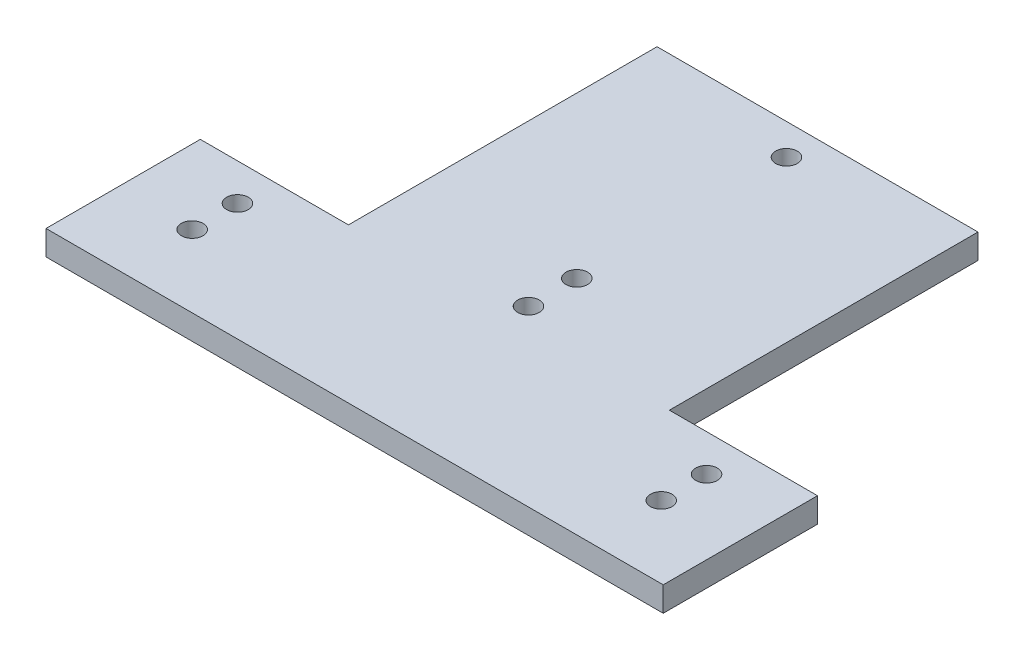
ISO-10303-21;
HEADER;
FILE_DESCRIPTION(('STEP AP214'),'2;1');
FILE_NAME('part.step','',(''),(''),'','','');
FILE_SCHEMA(('AUTOMOTIVE_DESIGN { 1 0 10303 214 1 1 1 1 }'));
ENDSEC;
DATA;
#1=APPLICATION_CONTEXT('core data for automotive mechanical design processes');
#2=APPLICATION_PROTOCOL_DEFINITION('international standard','automotive_design',2000,#1);
#3=PRODUCT_CONTEXT('',#1,'mechanical');
#4=PRODUCT('Part','Part','',(#3));
#5=PRODUCT_RELATED_PRODUCT_CATEGORY('part','',(#4));
#6=PRODUCT_DEFINITION_FORMATION('','',#4);
#7=PRODUCT_DEFINITION_CONTEXT('part definition',#1,'design');
#8=PRODUCT_DEFINITION('design','',#6,#7);
#9=PRODUCT_DEFINITION_SHAPE('','',#8);
#10=(LENGTH_UNIT() NAMED_UNIT(*) SI_UNIT(.MILLI.,.METRE.));
#11=(NAMED_UNIT(*) PLANE_ANGLE_UNIT() SI_UNIT($,.RADIAN.));
#12=(NAMED_UNIT(*) SI_UNIT($,.STERADIAN.) SOLID_ANGLE_UNIT());
#13=UNCERTAINTY_MEASURE_WITH_UNIT(LENGTH_MEASURE(1.E-05),#10,'distance_accuracy_value','');
#14=(GEOMETRIC_REPRESENTATION_CONTEXT(3) GLOBAL_UNCERTAINTY_ASSIGNED_CONTEXT((#13)) GLOBAL_UNIT_ASSIGNED_CONTEXT((#10,
#11,#12)) REPRESENTATION_CONTEXT('',''));
#15=CARTESIAN_POINT('',(0.,0.,0.));
#16=DIRECTION('',(0.,0.,1.));
#17=DIRECTION('',(1.,0.,0.));
#18=AXIS2_PLACEMENT_3D('',#15,#16,#17);
#19=CARTESIAN_POINT('',(50.,4.,0.));
#20=DIRECTION('',(1.,0.,0.));
#21=DIRECTION('',(0.,0.,-1.));
#22=AXIS2_PLACEMENT_3D('',#19,#20,#21);
#23=PLANE('',#22);
#24=DIRECTION('',(0.,0.,1.));
#25=VECTOR('',#24,1.);
#26=CARTESIAN_POINT('',(50.,0.,0.));
#27=LINE('',#26,#25);
#28=CARTESIAN_POINT('',(50.,0.,12.5));
#29=VERTEX_POINT('',#28);
#30=CARTESIAN_POINT('',(50.,0.,37.5));
#31=VERTEX_POINT('',#30);
#32=EDGE_CURVE('E175',#29,#31,#27,.T.);
#33=ORIENTED_EDGE('',*,*,#32,.F.);
#34=DIRECTION('',(0.,-1.,0.));
#35=VECTOR('',#34,1.);
#36=CARTESIAN_POINT('',(50.,4.,12.5));
#37=LINE('',#36,#35);
#38=CARTESIAN_POINT('',(50.,4.,12.5));
#39=VERTEX_POINT('',#38);
#40=EDGE_CURVE('E11',#39,#29,#37,.T.);
#41=ORIENTED_EDGE('',*,*,#40,.F.);
#42=DIRECTION('',(0.,0.,1.));
#43=VECTOR('',#42,1.);
#44=CARTESIAN_POINT('',(50.,4.,0.));
#45=LINE('',#44,#43);
#46=CARTESIAN_POINT('',(50.,4.,37.5));
#47=VERTEX_POINT('',#46);
#48=EDGE_CURVE('E413',#39,#47,#45,.T.);
#49=ORIENTED_EDGE('',*,*,#48,.T.);
#50=DIRECTION('',(0.,-1.,0.));
#51=VECTOR('',#50,1.);
#52=CARTESIAN_POINT('',(50.,4.,37.5));
#53=LINE('',#52,#51);
#54=EDGE_CURVE('E94',#47,#31,#53,.T.);
#55=ORIENTED_EDGE('',*,*,#54,.T.);
#56=EDGE_LOOP('',(#33,#41,#49,#55));
#57=FACE_BOUND('',#56,.T.);
#58=ADVANCED_FACE('F41',(#57),#23,.T.);
#59=CARTESIAN_POINT('',(0.,4.,12.5));
#60=DIRECTION('',(0.,0.,1.));
#61=DIRECTION('',(1.,0.,0.));
#62=AXIS2_PLACEMENT_3D('',#59,#60,#61);
#63=PLANE('',#62);
#64=DIRECTION('',(-1.,0.,0.));
#65=VECTOR('',#64,1.);
#66=CARTESIAN_POINT('',(0.,0.,12.5));
#67=LINE('',#66,#65);
#68=CARTESIAN_POINT('',(26.,0.,12.5));
#69=VERTEX_POINT('',#68);
#70=EDGE_CURVE('E178',#29,#69,#67,.T.);
#71=ORIENTED_EDGE('',*,*,#70,.T.);
#72=DIRECTION('',(0.,-1.,0.));
#73=VECTOR('',#72,1.);
#74=CARTESIAN_POINT('',(26.,4.,12.5));
#75=LINE('',#74,#73);
#76=CARTESIAN_POINT('',(26.,4.,12.5));
#77=VERTEX_POINT('',#76);
#78=EDGE_CURVE('E51',#77,#69,#75,.T.);
#79=ORIENTED_EDGE('',*,*,#78,.F.);
#80=DIRECTION('',(-1.,0.,0.));
#81=VECTOR('',#80,1.);
#82=CARTESIAN_POINT('',(0.,4.,12.5));
#83=LINE('',#82,#81);
#84=EDGE_CURVE('E408',#39,#77,#83,.T.);
#85=ORIENTED_EDGE('',*,*,#84,.F.);
#86=ORIENTED_EDGE('',*,*,#40,.T.);
#87=EDGE_LOOP('',(#71,#79,#85,#86));
#88=FACE_BOUND('',#87,.T.);
#89=ADVANCED_FACE('F227',(#88),#63,.F.);
#90=CARTESIAN_POINT('',(26.,4.,0.));
#91=DIRECTION('',(-1.,0.,0.));
#92=DIRECTION('',(0.,0.,1.));
#93=AXIS2_PLACEMENT_3D('',#90,#91,#92);
#94=PLANE('',#93);
#95=DIRECTION('',(0.,0.,-1.));
#96=VECTOR('',#95,1.);
#97=CARTESIAN_POINT('',(26.,0.,0.));
#98=LINE('',#97,#96);
#99=CARTESIAN_POINT('',(26.,0.,-37.5));
#100=VERTEX_POINT('',#99);
#101=EDGE_CURVE('E182',#69,#100,#98,.T.);
#102=ORIENTED_EDGE('',*,*,#101,.T.);
#103=DIRECTION('',(0.,-1.,0.));
#104=VECTOR('',#103,1.);
#105=CARTESIAN_POINT('',(26.,4.,-37.5));
#106=LINE('',#105,#104);
#107=CARTESIAN_POINT('',(26.,4.,-37.5));
#108=VERTEX_POINT('',#107);
#109=EDGE_CURVE('E215',#108,#100,#106,.T.);
#110=ORIENTED_EDGE('',*,*,#109,.F.);
#111=DIRECTION('',(0.,0.,-1.));
#112=VECTOR('',#111,1.);
#113=CARTESIAN_POINT('',(26.,4.,0.));
#114=LINE('',#113,#112);
#115=EDGE_CURVE('E223',#77,#108,#114,.T.);
#116=ORIENTED_EDGE('',*,*,#115,.F.);
#117=ORIENTED_EDGE('',*,*,#78,.T.);
#118=EDGE_LOOP('',(#102,#110,#116,#117));
#119=FACE_BOUND('',#118,.T.);
#120=ADVANCED_FACE('F221',(#119),#94,.F.);
#121=CARTESIAN_POINT('',(0.,4.,-37.5));
#122=DIRECTION('',(0.,0.,-1.));
#123=DIRECTION('',(-1.,0.,0.));
#124=AXIS2_PLACEMENT_3D('',#121,#122,#123);
#125=PLANE('',#124);
#126=DIRECTION('',(1.,0.,0.));
#127=VECTOR('',#126,1.);
#128=CARTESIAN_POINT('',(0.,0.,-37.5));
#129=LINE('',#128,#127);
#130=CARTESIAN_POINT('',(-26.,0.,-37.5));
#131=VERTEX_POINT('',#130);
#132=EDGE_CURVE('E186',#131,#100,#129,.T.);
#133=ORIENTED_EDGE('',*,*,#132,.F.);
#134=DIRECTION('',(0.,-1.,0.));
#135=VECTOR('',#134,1.);
#136=CARTESIAN_POINT('',(-26.,4.,-37.5));
#137=LINE('',#136,#135);
#138=CARTESIAN_POINT('',(-26.,4.,-37.5));
#139=VERTEX_POINT('',#138);
#140=EDGE_CURVE('E212',#139,#131,#137,.T.);
#141=ORIENTED_EDGE('',*,*,#140,.F.);
#142=DIRECTION('',(1.,0.,0.));
#143=VECTOR('',#142,1.);
#144=CARTESIAN_POINT('',(0.,4.,-37.5));
#145=LINE('',#144,#143);
#146=EDGE_CURVE('E141',#139,#108,#145,.T.);
#147=ORIENTED_EDGE('',*,*,#146,.T.);
#148=ORIENTED_EDGE('',*,*,#109,.T.);
#149=EDGE_LOOP('',(#133,#141,#147,#148));
#150=FACE_BOUND('',#149,.T.);
#151=ADVANCED_FACE('F302',(#150),#125,.T.);
#152=CARTESIAN_POINT('',(-26.,4.,0.));
#153=DIRECTION('',(-1.,0.,0.));
#154=DIRECTION('',(0.,0.,1.));
#155=AXIS2_PLACEMENT_3D('',#152,#153,#154);
#156=PLANE('',#155);
#157=DIRECTION('',(0.,0.,-1.));
#158=VECTOR('',#157,1.);
#159=CARTESIAN_POINT('',(-26.,0.,0.));
#160=LINE('',#159,#158);
#161=CARTESIAN_POINT('',(-26.,0.,12.5));
#162=VERTEX_POINT('',#161);
#163=EDGE_CURVE('E190',#162,#131,#160,.T.);
#164=ORIENTED_EDGE('',*,*,#163,.F.);
#165=DIRECTION('',(0.,-1.,0.));
#166=VECTOR('',#165,1.);
#167=CARTESIAN_POINT('',(-26.,4.,12.5));
#168=LINE('',#167,#166);
#169=CARTESIAN_POINT('',(-26.,4.,12.5));
#170=VERTEX_POINT('',#169);
#171=EDGE_CURVE('E124',#170,#162,#168,.T.);
#172=ORIENTED_EDGE('',*,*,#171,.F.);
#173=DIRECTION('',(0.,0.,-1.));
#174=VECTOR('',#173,1.);
#175=CARTESIAN_POINT('',(-26.,4.,0.));
#176=LINE('',#175,#174);
#177=EDGE_CURVE('E137',#170,#139,#176,.T.);
#178=ORIENTED_EDGE('',*,*,#177,.T.);
#179=ORIENTED_EDGE('',*,*,#140,.T.);
#180=EDGE_LOOP('',(#164,#172,#178,#179));
#181=FACE_BOUND('',#180,.T.);
#182=ADVANCED_FACE('F299',(#181),#156,.T.);
#183=CARTESIAN_POINT('',(0.,4.,12.5));
#184=DIRECTION('',(0.,0.,-1.));
#185=DIRECTION('',(-1.,0.,0.));
#186=AXIS2_PLACEMENT_3D('',#183,#184,#185);
#187=PLANE('',#186);
#188=DIRECTION('',(1.,0.,0.));
#189=VECTOR('',#188,1.);
#190=CARTESIAN_POINT('',(0.,0.,12.5));
#191=LINE('',#190,#189);
#192=CARTESIAN_POINT('',(-50.,0.,12.5));
#193=VERTEX_POINT('',#192);
#194=EDGE_CURVE('E120',#193,#162,#191,.T.);
#195=ORIENTED_EDGE('',*,*,#194,.F.);
#196=DIRECTION('',(0.,-1.,0.));
#197=VECTOR('',#196,1.);
#198=CARTESIAN_POINT('',(-50.,4.,12.5));
#199=LINE('',#198,#197);
#200=CARTESIAN_POINT('',(-50.,4.,12.5));
#201=VERTEX_POINT('',#200);
#202=EDGE_CURVE('E114',#201,#193,#199,.T.);
#203=ORIENTED_EDGE('',*,*,#202,.F.);
#204=DIRECTION('',(1.,0.,0.));
#205=VECTOR('',#204,1.);
#206=CARTESIAN_POINT('',(0.,4.,12.5));
#207=LINE('',#206,#205);
#208=EDGE_CURVE('E118',#201,#170,#207,.T.);
#209=ORIENTED_EDGE('',*,*,#208,.T.);
#210=ORIENTED_EDGE('',*,*,#171,.T.);
#211=EDGE_LOOP('',(#195,#203,#209,#210));
#212=FACE_BOUND('',#211,.T.);
#213=ADVANCED_FACE('F116',(#212),#187,.T.);
#214=CARTESIAN_POINT('',(-50.,4.,0.));
#215=DIRECTION('',(1.,0.,0.));
#216=DIRECTION('',(0.,0.,-1.));
#217=AXIS2_PLACEMENT_3D('',#214,#215,#216);
#218=PLANE('',#217);
#219=DIRECTION('',(0.,0.,1.));
#220=VECTOR('',#219,1.);
#221=CARTESIAN_POINT('',(-50.,0.,0.));
#222=LINE('',#221,#220);
#223=CARTESIAN_POINT('',(-50.,0.,37.5));
#224=VERTEX_POINT('',#223);
#225=EDGE_CURVE('E196',#193,#224,#222,.T.);
#226=ORIENTED_EDGE('',*,*,#225,.T.);
#227=DIRECTION('',(0.,-1.,0.));
#228=VECTOR('',#227,1.);
#229=CARTESIAN_POINT('',(-50.,4.,37.5));
#230=LINE('',#229,#228);
#231=CARTESIAN_POINT('',(-50.,4.,37.5));
#232=VERTEX_POINT('',#231);
#233=EDGE_CURVE('E125',#232,#224,#230,.T.);
#234=ORIENTED_EDGE('',*,*,#233,.F.);
#235=DIRECTION('',(0.,0.,1.));
#236=VECTOR('',#235,1.);
#237=CARTESIAN_POINT('',(-50.,4.,0.));
#238=LINE('',#237,#236);
#239=EDGE_CURVE('E128',#201,#232,#238,.T.);
#240=ORIENTED_EDGE('',*,*,#239,.F.);
#241=ORIENTED_EDGE('',*,*,#202,.T.);
#242=EDGE_LOOP('',(#226,#234,#240,#241));
#243=FACE_BOUND('',#242,.T.);
#244=ADVANCED_FACE('F129',(#243),#218,.F.);
#245=CARTESIAN_POINT('',(0.,4.,37.5));
#246=DIRECTION('',(0.,0.,-1.));
#247=DIRECTION('',(-1.,0.,0.));
#248=AXIS2_PLACEMENT_3D('',#245,#246,#247);
#249=PLANE('',#248);
#250=DIRECTION('',(1.,0.,0.));
#251=VECTOR('',#250,1.);
#252=CARTESIAN_POINT('',(0.,0.,37.5));
#253=LINE('',#252,#251);
#254=EDGE_CURVE('E87',#224,#31,#253,.T.);
#255=ORIENTED_EDGE('',*,*,#254,.T.);
#256=ORIENTED_EDGE('',*,*,#54,.F.);
#257=DIRECTION('',(1.,0.,0.));
#258=VECTOR('',#257,1.);
#259=CARTESIAN_POINT('',(0.,4.,37.5));
#260=LINE('',#259,#258);
#261=EDGE_CURVE('E59',#232,#47,#260,.T.);
#262=ORIENTED_EDGE('',*,*,#261,.F.);
#263=ORIENTED_EDGE('',*,*,#233,.T.);
#264=EDGE_LOOP('',(#255,#256,#262,#263));
#265=FACE_BOUND('',#264,.T.);
#266=ADVANCED_FACE('F242',(#265),#249,.F.);
#267=CARTESIAN_POINT('',(-7.33373621660486E-13,4.,1.50405140920949));
#268=DIRECTION('',(0.,-1.,0.));
#269=DIRECTION('',(0.,0.,-1.));
#270=AXIS2_PLACEMENT_3D('',#267,#268,#269);
#271=CYLINDRICAL_SURFACE('',#270,1.75);
#272=CARTESIAN_POINT('',(-7.33373621660486E-13,4.,1.50405140920949));
#273=DIRECTION('',(0.,1.,0.));
#274=DIRECTION('',(0.,0.,1.));
#275=AXIS2_PLACEMENT_3D('',#272,#273,#274);
#276=CIRCLE('',#275,1.75);
#277=CARTESIAN_POINT('',(-7.33373621660486E-13,4.,3.25405140920949));
#278=VERTEX_POINT('',#277);
#279=EDGE_CURVE('E416',#278,#278,#276,.T.);
#280=ORIENTED_EDGE('',*,*,#279,.T.);
#281=EDGE_LOOP('',(#280));
#282=FACE_BOUND('',#281,.T.);
#283=CARTESIAN_POINT('',(-7.33373621660486E-13,0.,1.50405140920949));
#284=DIRECTION('',(0.,1.,0.));
#285=DIRECTION('',(0.,0.,1.));
#286=AXIS2_PLACEMENT_3D('',#283,#284,#285);
#287=CIRCLE('',#286,1.75);
#288=CARTESIAN_POINT('',(-7.33373621660486E-13,0.,3.25405140920949));
#289=VERTEX_POINT('',#288);
#290=EDGE_CURVE('E171',#289,#289,#287,.T.);
#291=ORIENTED_EDGE('',*,*,#290,.F.);
#292=EDGE_LOOP('',(#291));
#293=FACE_BOUND('',#292,.T.);
#294=ADVANCED_FACE('F238',(#282,#293),#271,.F.);
#295=CARTESIAN_POINT('',(-7.88016939159167E-13,4.,9.32928548546922));
#296=DIRECTION('',(0.,-1.,0.));
#297=DIRECTION('',(0.,0.,-1.));
#298=AXIS2_PLACEMENT_3D('',#295,#296,#297);
#299=CYLINDRICAL_SURFACE('',#298,1.75);
#300=CARTESIAN_POINT('',(-7.88016939159167E-13,4.,9.32928548546922));
#301=DIRECTION('',(0.,1.,0.));
#302=DIRECTION('',(0.,0.,1.));
#303=AXIS2_PLACEMENT_3D('',#300,#301,#302);
#304=CIRCLE('',#303,1.75);
#305=CARTESIAN_POINT('',(-7.88016939159167E-13,4.,11.0792854854692));
#306=VERTEX_POINT('',#305);
#307=EDGE_CURVE('E420',#306,#306,#304,.T.);
#308=ORIENTED_EDGE('',*,*,#307,.T.);
#309=EDGE_LOOP('',(#308));
#310=FACE_BOUND('',#309,.T.);
#311=CARTESIAN_POINT('',(-7.88016939159167E-13,0.,9.32928548546922));
#312=DIRECTION('',(0.,1.,0.));
#313=DIRECTION('',(0.,0.,1.));
#314=AXIS2_PLACEMENT_3D('',#311,#312,#313);
#315=CIRCLE('',#314,1.75);
#316=CARTESIAN_POINT('',(-7.88016939159167E-13,0.,11.0792854854692));
#317=VERTEX_POINT('',#316);
#318=EDGE_CURVE('E167',#317,#317,#315,.T.);
#319=ORIENTED_EDGE('',*,*,#318,.F.);
#320=EDGE_LOOP('',(#319));
#321=FACE_BOUND('',#320,.T.);
#322=ADVANCED_FACE('F241',(#310,#321),#299,.F.);
#323=CARTESIAN_POINT('',(-38.,4.,18.4798270893372));
#324=DIRECTION('',(0.,-1.,0.));
#325=DIRECTION('',(0.,0.,-1.));
#326=AXIS2_PLACEMENT_3D('',#323,#324,#325);
#327=CYLINDRICAL_SURFACE('',#326,1.75);
#328=CARTESIAN_POINT('',(-38.,4.,18.4798270893372));
#329=DIRECTION('',(0.,1.,0.));
#330=DIRECTION('',(0.,0.,1.));
#331=AXIS2_PLACEMENT_3D('',#328,#329,#330);
#332=CIRCLE('',#331,1.75);
#333=CARTESIAN_POINT('',(-38.,4.,20.2298270893372));
#334=VERTEX_POINT('',#333);
#335=EDGE_CURVE('E424',#334,#334,#332,.T.);
#336=ORIENTED_EDGE('',*,*,#335,.T.);
#337=EDGE_LOOP('',(#336));
#338=FACE_BOUND('',#337,.T.);
#339=CARTESIAN_POINT('',(-38.,0.,18.4798270893372));
#340=DIRECTION('',(0.,1.,0.));
#341=DIRECTION('',(0.,0.,1.));
#342=AXIS2_PLACEMENT_3D('',#339,#340,#341);
#343=CIRCLE('',#342,1.75);
#344=CARTESIAN_POINT('',(-38.,0.,20.2298270893372));
#345=VERTEX_POINT('',#344);
#346=EDGE_CURVE('E163',#345,#345,#343,.T.);
#347=ORIENTED_EDGE('',*,*,#346,.F.);
#348=EDGE_LOOP('',(#347));
#349=FACE_BOUND('',#348,.T.);
#350=ADVANCED_FACE('F246',(#338,#349),#327,.F.);
#351=CARTESIAN_POINT('',(-38.,4.,25.8160657609179));
#352=DIRECTION('',(0.,-1.,0.));
#353=DIRECTION('',(0.,0.,-1.));
#354=AXIS2_PLACEMENT_3D('',#351,#352,#353);
#355=CYLINDRICAL_SURFACE('',#354,1.75);
#356=CARTESIAN_POINT('',(-38.,4.,25.8160657609179));
#357=DIRECTION('',(0.,1.,0.));
#358=DIRECTION('',(0.,0.,1.));
#359=AXIS2_PLACEMENT_3D('',#356,#357,#358);
#360=CIRCLE('',#359,1.75);
#361=CARTESIAN_POINT('',(-38.,4.,27.5660657609179));
#362=VERTEX_POINT('',#361);
#363=EDGE_CURVE('E428',#362,#362,#360,.T.);
#364=ORIENTED_EDGE('',*,*,#363,.T.);
#365=EDGE_LOOP('',(#364));
#366=FACE_BOUND('',#365,.T.);
#367=CARTESIAN_POINT('',(-38.,0.,25.8160657609179));
#368=DIRECTION('',(0.,1.,0.));
#369=DIRECTION('',(0.,0.,1.));
#370=AXIS2_PLACEMENT_3D('',#367,#368,#369);
#371=CIRCLE('',#370,1.75);
#372=CARTESIAN_POINT('',(-38.,0.,27.5660657609179));
#373=VERTEX_POINT('',#372);
#374=EDGE_CURVE('E159',#373,#373,#371,.T.);
#375=ORIENTED_EDGE('',*,*,#374,.F.);
#376=EDGE_LOOP('',(#375));
#377=FACE_BOUND('',#376,.T.);
#378=ADVANCED_FACE('F250',(#366,#377),#355,.F.);
#379=CARTESIAN_POINT('',(38.,4.,25.8160657609179));
#380=DIRECTION('',(0.,-1.,0.));
#381=DIRECTION('',(0.,0.,-1.));
#382=AXIS2_PLACEMENT_3D('',#379,#380,#381);
#383=CYLINDRICAL_SURFACE('',#382,1.75);
#384=CARTESIAN_POINT('',(38.,4.,25.8160657609179));
#385=DIRECTION('',(0.,1.,0.));
#386=DIRECTION('',(0.,0.,1.));
#387=AXIS2_PLACEMENT_3D('',#384,#385,#386);
#388=CIRCLE('',#387,1.75);
#389=CARTESIAN_POINT('',(38.,4.,27.5660657609179));
#390=VERTEX_POINT('',#389);
#391=EDGE_CURVE('E265',#390,#390,#388,.F.);
#392=ORIENTED_EDGE('',*,*,#391,.F.);
#393=EDGE_LOOP('',(#392));
#394=FACE_BOUND('',#393,.T.);
#395=CARTESIAN_POINT('',(38.,0.,25.8160657609179));
#396=DIRECTION('',(0.,1.,0.));
#397=DIRECTION('',(0.,0.,1.));
#398=AXIS2_PLACEMENT_3D('',#395,#396,#397);
#399=CIRCLE('',#398,1.75);
#400=CARTESIAN_POINT('',(38.,0.,27.5660657609179));
#401=VERTEX_POINT('',#400);
#402=EDGE_CURVE('E155',#401,#401,#399,.F.);
#403=ORIENTED_EDGE('',*,*,#402,.T.);
#404=EDGE_LOOP('',(#403));
#405=FACE_BOUND('',#404,.T.);
#406=ADVANCED_FACE('F253',(#394,#405),#383,.F.);
#407=CARTESIAN_POINT('',(0.,4.,-32.4637668703493));
#408=DIRECTION('',(0.,-1.,0.));
#409=DIRECTION('',(0.,0.,-1.));
#410=AXIS2_PLACEMENT_3D('',#407,#408,#409);
#411=CYLINDRICAL_SURFACE('',#410,1.75);
#412=CARTESIAN_POINT('',(0.,4.,-32.4637668703493));
#413=DIRECTION('',(0.,1.,0.));
#414=DIRECTION('',(0.,0.,1.));
#415=AXIS2_PLACEMENT_3D('',#412,#413,#414);
#416=CIRCLE('',#415,1.75);
#417=CARTESIAN_POINT('',(0.,4.,-30.7137668703493));
#418=VERTEX_POINT('',#417);
#419=EDGE_CURVE('E205',#418,#418,#416,.T.);
#420=ORIENTED_EDGE('',*,*,#419,.T.);
#421=EDGE_LOOP('',(#420));
#422=FACE_BOUND('',#421,.T.);
#423=CARTESIAN_POINT('',(0.,0.,-32.4637668703493));
#424=DIRECTION('',(0.,1.,0.));
#425=DIRECTION('',(0.,0.,1.));
#426=AXIS2_PLACEMENT_3D('',#423,#424,#425);
#427=CIRCLE('',#426,1.75);
#428=CARTESIAN_POINT('',(0.,0.,-30.7137668703493));
#429=VERTEX_POINT('',#428);
#430=EDGE_CURVE('E151',#429,#429,#427,.T.);
#431=ORIENTED_EDGE('',*,*,#430,.F.);
#432=EDGE_LOOP('',(#431));
#433=FACE_BOUND('',#432,.T.);
#434=ADVANCED_FACE('F43',(#422,#433),#411,.F.);
#435=CARTESIAN_POINT('',(38.,4.,18.4798270893372));
#436=DIRECTION('',(0.,-1.,0.));
#437=DIRECTION('',(0.,0.,-1.));
#438=AXIS2_PLACEMENT_3D('',#435,#436,#437);
#439=CYLINDRICAL_SURFACE('',#438,1.75);
#440=CARTESIAN_POINT('',(38.,4.,18.4798270893372));
#441=DIRECTION('',(0.,1.,0.));
#442=DIRECTION('',(0.,0.,1.));
#443=AXIS2_PLACEMENT_3D('',#440,#441,#442);
#444=CIRCLE('',#443,1.75);
#445=CARTESIAN_POINT('',(38.,4.,20.2298270893372));
#446=VERTEX_POINT('',#445);
#447=EDGE_CURVE('E147',#446,#446,#444,.F.);
#448=ORIENTED_EDGE('',*,*,#447,.F.);
#449=EDGE_LOOP('',(#448));
#450=FACE_BOUND('',#449,.T.);
#451=CARTESIAN_POINT('',(38.,0.,18.4798270893372));
#452=DIRECTION('',(0.,1.,0.));
#453=DIRECTION('',(0.,0.,1.));
#454=AXIS2_PLACEMENT_3D('',#451,#452,#453);
#455=CIRCLE('',#454,1.75);
#456=CARTESIAN_POINT('',(38.,0.,20.2298270893372));
#457=VERTEX_POINT('',#456);
#458=EDGE_CURVE('E201',#457,#457,#455,.F.);
#459=ORIENTED_EDGE('',*,*,#458,.T.);
#460=EDGE_LOOP('',(#459));
#461=FACE_BOUND('',#460,.T.);
#462=ADVANCED_FACE('F260',(#450,#461),#439,.F.);
#463=CARTESIAN_POINT('',(0.,4.,0.));
#464=DIRECTION('',(0.,1.,0.));
#465=DIRECTION('',(0.,0.,1.));
#466=AXIS2_PLACEMENT_3D('',#463,#464,#465);
#467=PLANE('',#466);
#468=ORIENTED_EDGE('',*,*,#419,.F.);
#469=EDGE_LOOP('',(#468));
#470=FACE_BOUND('',#469,.T.);
#471=ORIENTED_EDGE('',*,*,#391,.T.);
#472=EDGE_LOOP('',(#471));
#473=FACE_BOUND('',#472,.T.);
#474=ORIENTED_EDGE('',*,*,#363,.F.);
#475=EDGE_LOOP('',(#474));
#476=FACE_BOUND('',#475,.T.);
#477=ORIENTED_EDGE('',*,*,#335,.F.);
#478=EDGE_LOOP('',(#477));
#479=FACE_BOUND('',#478,.T.);
#480=ORIENTED_EDGE('',*,*,#307,.F.);
#481=EDGE_LOOP('',(#480));
#482=FACE_BOUND('',#481,.T.);
#483=ORIENTED_EDGE('',*,*,#279,.F.);
#484=EDGE_LOOP('',(#483));
#485=FACE_BOUND('',#484,.T.);
#486=ORIENTED_EDGE('',*,*,#48,.F.);
#487=ORIENTED_EDGE('',*,*,#84,.T.);
#488=ORIENTED_EDGE('',*,*,#115,.T.);
#489=ORIENTED_EDGE('',*,*,#146,.F.);
#490=ORIENTED_EDGE('',*,*,#177,.F.);
#491=ORIENTED_EDGE('',*,*,#208,.F.);
#492=ORIENTED_EDGE('',*,*,#239,.T.);
#493=ORIENTED_EDGE('',*,*,#261,.T.);
#494=EDGE_LOOP('',(#486,#487,#488,#489,#490,#491,#492,#493));
#495=FACE_BOUND('',#494,.T.);
#496=ORIENTED_EDGE('',*,*,#447,.T.);
#497=EDGE_LOOP('',(#496));
#498=FACE_BOUND('',#497,.T.);
#499=ADVANCED_FACE('F133',(#470,#473,#476,#479,#482,#485,#495,#498),#467,.T.);
#500=CARTESIAN_POINT('',(0.,0.,0.));
#501=DIRECTION('',(0.,1.,0.));
#502=DIRECTION('',(0.,0.,1.));
#503=AXIS2_PLACEMENT_3D('',#500,#501,#502);
#504=PLANE('',#503);
#505=ORIENTED_EDGE('',*,*,#430,.T.);
#506=EDGE_LOOP('',(#505));
#507=FACE_BOUND('',#506,.T.);
#508=ORIENTED_EDGE('',*,*,#402,.F.);
#509=EDGE_LOOP('',(#508));
#510=FACE_BOUND('',#509,.T.);
#511=ORIENTED_EDGE('',*,*,#374,.T.);
#512=EDGE_LOOP('',(#511));
#513=FACE_BOUND('',#512,.T.);
#514=ORIENTED_EDGE('',*,*,#346,.T.);
#515=EDGE_LOOP('',(#514));
#516=FACE_BOUND('',#515,.T.);
#517=ORIENTED_EDGE('',*,*,#318,.T.);
#518=EDGE_LOOP('',(#517));
#519=FACE_BOUND('',#518,.T.);
#520=ORIENTED_EDGE('',*,*,#290,.T.);
#521=EDGE_LOOP('',(#520));
#522=FACE_BOUND('',#521,.T.);
#523=ORIENTED_EDGE('',*,*,#32,.T.);
#524=ORIENTED_EDGE('',*,*,#254,.F.);
#525=ORIENTED_EDGE('',*,*,#225,.F.);
#526=ORIENTED_EDGE('',*,*,#194,.T.);
#527=ORIENTED_EDGE('',*,*,#163,.T.);
#528=ORIENTED_EDGE('',*,*,#132,.T.);
#529=ORIENTED_EDGE('',*,*,#101,.F.);
#530=ORIENTED_EDGE('',*,*,#70,.F.);
#531=EDGE_LOOP('',(#523,#524,#525,#526,#527,#528,#529,#530));
#532=FACE_BOUND('',#531,.T.);
#533=ORIENTED_EDGE('',*,*,#458,.F.);
#534=EDGE_LOOP('',(#533));
#535=FACE_BOUND('',#534,.T.);
#536=ADVANCED_FACE('F228',(#507,#510,#513,#516,#519,#522,#532,#535),#504,.F.);
#537=CLOSED_SHELL('',(#58,#89,#120,#151,#182,#213,#244,#266,#294,#322,#350,#378,#406,#434,#462,
#499,#536));
#538=MANIFOLD_SOLID_BREP('B2',#537);
#539=ADVANCED_BREP_SHAPE_REPRESENTATION('',(#18,#538),#14);
#540=SHAPE_DEFINITION_REPRESENTATION(#9,#539);
ENDSEC;
END-ISO-10303-21;
